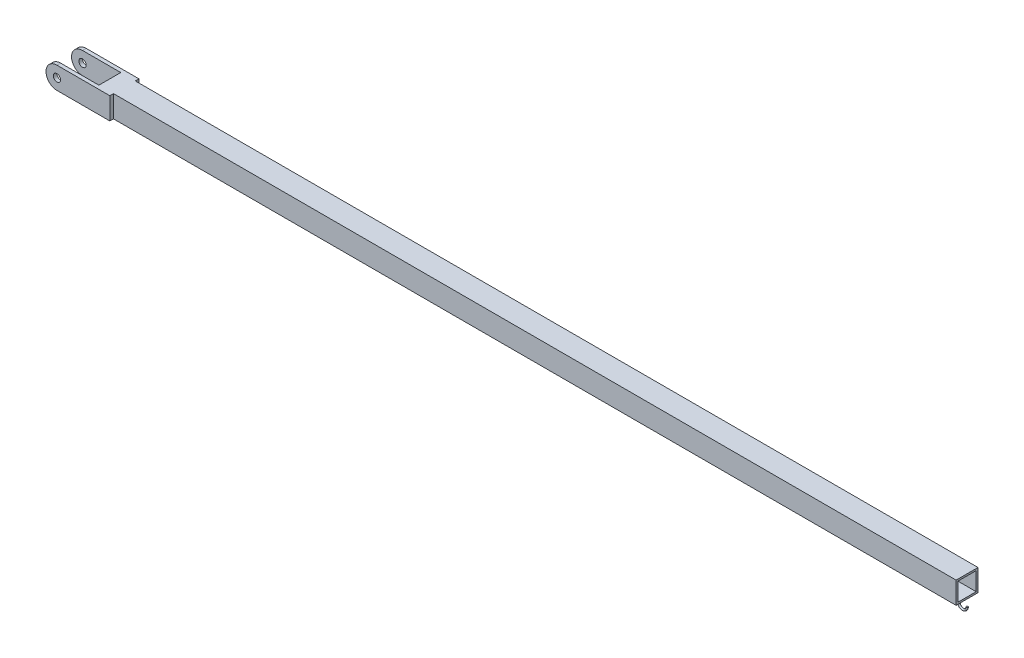
ISO-10303-21;
HEADER;
FILE_DESCRIPTION(('STEP AP214'),'2;1');
FILE_NAME('part.step','',(''),(''),'','','');
FILE_SCHEMA(('AUTOMOTIVE_DESIGN { 1 0 10303 214 1 1 1 1 }'));
ENDSEC;
DATA;
#1=APPLICATION_CONTEXT('core data for automotive mechanical design processes');
#2=APPLICATION_PROTOCOL_DEFINITION('international standard','automotive_design',2000,#1);
#3=PRODUCT_CONTEXT('',#1,'mechanical');
#4=PRODUCT('Part','Part','',(#3));
#5=PRODUCT_RELATED_PRODUCT_CATEGORY('part','',(#4));
#6=PRODUCT_DEFINITION_FORMATION('','',#4);
#7=PRODUCT_DEFINITION_CONTEXT('part definition',#1,'design');
#8=PRODUCT_DEFINITION('design','',#6,#7);
#9=PRODUCT_DEFINITION_SHAPE('','',#8);
#10=(LENGTH_UNIT() NAMED_UNIT(*) SI_UNIT(.MILLI.,.METRE.));
#11=(NAMED_UNIT(*) PLANE_ANGLE_UNIT() SI_UNIT($,.RADIAN.));
#12=(NAMED_UNIT(*) SI_UNIT($,.STERADIAN.) SOLID_ANGLE_UNIT());
#13=UNCERTAINTY_MEASURE_WITH_UNIT(LENGTH_MEASURE(1.E-05),#10,'distance_accuracy_value','');
#14=(GEOMETRIC_REPRESENTATION_CONTEXT(3) GLOBAL_UNCERTAINTY_ASSIGNED_CONTEXT((#13)) GLOBAL_UNIT_ASSIGNED_CONTEXT((#10,
#11,#12)) REPRESENTATION_CONTEXT('',''));
#15=CARTESIAN_POINT('',(0.,0.,0.));
#16=DIRECTION('',(0.,0.,1.));
#17=DIRECTION('',(1.,0.,0.));
#18=AXIS2_PLACEMENT_3D('',#15,#16,#17);
#19=CARTESIAN_POINT('',(-1492.25,-19.05,-19.05));
#20=DIRECTION('',(0.,0.,-1.));
#21=DIRECTION('',(-1.,0.,0.));
#22=AXIS2_PLACEMENT_3D('',#19,#20,#21);
#23=PLANE('',#22);
#24=DIRECTION('',(1.,0.,0.));
#25=VECTOR('',#24,1.);
#26=CARTESIAN_POINT('',(-1492.25,-19.05,-19.05));
#27=LINE('',#26,#25);
#28=CARTESIAN_POINT('',(-1466.85,-19.05,-19.05));
#29=VERTEX_POINT('',#28);
#30=CARTESIAN_POINT('',(0.,-19.05,-19.05));
#31=VERTEX_POINT('',#30);
#32=EDGE_CURVE('E290',#29,#31,#27,.T.);
#33=ORIENTED_EDGE('',*,*,#32,.F.);
#34=DIRECTION('',(0.,1.,0.));
#35=VECTOR('',#34,1.);
#36=CARTESIAN_POINT('',(-1466.85,19.05,-19.05));
#37=LINE('',#36,#35);
#38=CARTESIAN_POINT('',(-1466.85,19.05,-19.05));
#39=VERTEX_POINT('',#38);
#40=EDGE_CURVE('E187',#29,#39,#37,.T.);
#41=ORIENTED_EDGE('',*,*,#40,.T.);
#42=DIRECTION('',(1.,0.,0.));
#43=VECTOR('',#42,1.);
#44=CARTESIAN_POINT('',(-1492.25,19.05,-19.05));
#45=LINE('',#44,#43);
#46=CARTESIAN_POINT('',(0.,19.05,-19.05));
#47=VERTEX_POINT('',#46);
#48=EDGE_CURVE('E288',#39,#47,#45,.T.);
#49=ORIENTED_EDGE('',*,*,#48,.T.);
#50=DIRECTION('',(0.,1.,0.));
#51=VECTOR('',#50,1.);
#52=CARTESIAN_POINT('',(0.,-19.05,-19.05));
#53=LINE('',#52,#51);
#54=EDGE_CURVE('E282',#31,#47,#53,.T.);
#55=ORIENTED_EDGE('',*,*,#54,.F.);
#56=EDGE_LOOP('',(#33,#41,#49,#55));
#57=FACE_BOUND('',#56,.T.);
#58=ADVANCED_FACE('F36',(#57),#23,.T.);
#59=CARTESIAN_POINT('',(-1492.25,-19.05,19.05));
#60=DIRECTION('',(0.,0.,1.));
#61=DIRECTION('',(1.,0.,0.));
#62=AXIS2_PLACEMENT_3D('',#59,#60,#61);
#63=PLANE('',#62);
#64=DIRECTION('',(0.,1.,0.));
#65=VECTOR('',#64,1.);
#66=CARTESIAN_POINT('',(-1466.85,19.05,19.05));
#67=LINE('',#66,#65);
#68=CARTESIAN_POINT('',(-1466.85,-19.05,19.05));
#69=VERTEX_POINT('',#68);
#70=CARTESIAN_POINT('',(-1466.85,19.05,19.05));
#71=VERTEX_POINT('',#70);
#72=EDGE_CURVE('E61',#69,#71,#67,.T.);
#73=ORIENTED_EDGE('',*,*,#72,.F.);
#74=DIRECTION('',(1.,0.,0.));
#75=VECTOR('',#74,1.);
#76=CARTESIAN_POINT('',(-1492.25,-19.05,19.05));
#77=LINE('',#76,#75);
#78=CARTESIAN_POINT('',(0.,-19.05,19.05));
#79=VERTEX_POINT('',#78);
#80=EDGE_CURVE('E276',#69,#79,#77,.T.);
#81=ORIENTED_EDGE('',*,*,#80,.T.);
#82=DIRECTION('',(0.,-1.,0.));
#83=VECTOR('',#82,1.);
#84=CARTESIAN_POINT('',(0.,-19.05,19.05));
#85=LINE('',#84,#83);
#86=CARTESIAN_POINT('',(0.,19.05,19.05));
#87=VERTEX_POINT('',#86);
#88=EDGE_CURVE('E234',#87,#79,#85,.T.);
#89=ORIENTED_EDGE('',*,*,#88,.F.);
#90=DIRECTION('',(1.,0.,0.));
#91=VECTOR('',#90,1.);
#92=CARTESIAN_POINT('',(-1492.25,19.05,19.05));
#93=LINE('',#92,#91);
#94=EDGE_CURVE('E45',#71,#87,#93,.T.);
#95=ORIENTED_EDGE('',*,*,#94,.F.);
#96=EDGE_LOOP('',(#73,#81,#89,#95));
#97=FACE_BOUND('',#96,.T.);
#98=ADVANCED_FACE('F38',(#97),#63,.T.);
#99=CARTESIAN_POINT('',(-1492.25,19.05,-19.05));
#100=DIRECTION('',(0.,1.,0.));
#101=DIRECTION('',(0.,0.,1.));
#102=AXIS2_PLACEMENT_3D('',#99,#100,#101);
#103=PLANE('',#102);
#104=DIRECTION('',(0.,0.,1.));
#105=VECTOR('',#104,1.);
#106=CARTESIAN_POINT('',(0.,19.05,-19.05));
#107=LINE('',#106,#105);
#108=EDGE_CURVE('E268',#47,#87,#107,.T.);
#109=ORIENTED_EDGE('',*,*,#108,.F.);
#110=ORIENTED_EDGE('',*,*,#48,.F.);
#111=DIRECTION('',(0.,0.,1.));
#112=VECTOR('',#111,1.);
#113=CARTESIAN_POINT('',(-1466.85,19.05,-25.4));
#114=LINE('',#113,#112);
#115=CARTESIAN_POINT('',(-1466.85,19.05,-25.4));
#116=VERTEX_POINT('',#115);
#117=EDGE_CURVE('E53',#116,#39,#114,.T.);
#118=ORIENTED_EDGE('',*,*,#117,.F.);
#119=DIRECTION('',(-1.,0.,0.));
#120=VECTOR('',#119,1.);
#121=CARTESIAN_POINT('',(-1558.925,19.0499999999996,-25.4));
#122=LINE('',#121,#120);
#123=CARTESIAN_POINT('',(-1558.925,19.0499999999996,-25.4));
#124=VERTEX_POINT('',#123);
#125=EDGE_CURVE('E173',#116,#124,#122,.T.);
#126=ORIENTED_EDGE('',*,*,#125,.T.);
#127=DIRECTION('',(0.,0.,1.));
#128=VECTOR('',#127,1.);
#129=CARTESIAN_POINT('',(-1558.925,19.0499999999996,-25.4));
#130=LINE('',#129,#128);
#131=CARTESIAN_POINT('',(-1558.925,19.0499999999996,-19.05));
#132=VERTEX_POINT('',#131);
#133=EDGE_CURVE('E185',#124,#132,#130,.T.);
#134=ORIENTED_EDGE('',*,*,#133,.T.);
#135=DIRECTION('',(-1.,0.,0.));
#136=VECTOR('',#135,1.);
#137=CARTESIAN_POINT('',(-1492.25,19.05,-19.05));
#138=LINE('',#137,#136);
#139=CARTESIAN_POINT('',(-1492.25,19.05,-19.05));
#140=VERTEX_POINT('',#139);
#141=EDGE_CURVE('E172',#140,#132,#138,.T.);
#142=ORIENTED_EDGE('',*,*,#141,.F.);
#143=DIRECTION('',(0.,0.,1.));
#144=VECTOR('',#143,1.);
#145=CARTESIAN_POINT('',(-1492.25,19.05,-19.05));
#146=LINE('',#145,#144);
#147=CARTESIAN_POINT('',(-1492.25,19.05,19.05));
#148=VERTEX_POINT('',#147);
#149=EDGE_CURVE('E273',#140,#148,#146,.T.);
#150=ORIENTED_EDGE('',*,*,#149,.T.);
#151=DIRECTION('',(-1.,0.,0.));
#152=VECTOR('',#151,1.);
#153=CARTESIAN_POINT('',(-1492.25,19.05,19.05));
#154=LINE('',#153,#152);
#155=CARTESIAN_POINT('',(-1558.925,19.0499999999996,19.05));
#156=VERTEX_POINT('',#155);
#157=EDGE_CURVE('E205',#148,#156,#154,.T.);
#158=ORIENTED_EDGE('',*,*,#157,.T.);
#159=DIRECTION('',(0.,0.,-1.));
#160=VECTOR('',#159,1.);
#161=CARTESIAN_POINT('',(-1558.925,19.0499999999996,25.4));
#162=LINE('',#161,#160);
#163=CARTESIAN_POINT('',(-1558.925,19.0499999999996,25.4));
#164=VERTEX_POINT('',#163);
#165=EDGE_CURVE('E228',#164,#156,#162,.T.);
#166=ORIENTED_EDGE('',*,*,#165,.F.);
#167=DIRECTION('',(-1.,0.,0.));
#168=VECTOR('',#167,1.);
#169=CARTESIAN_POINT('',(-1558.925,19.0499999999996,25.4));
#170=LINE('',#169,#168);
#171=CARTESIAN_POINT('',(-1466.85,19.05,25.4));
#172=VERTEX_POINT('',#171);
#173=EDGE_CURVE('E201',#172,#164,#170,.T.);
#174=ORIENTED_EDGE('',*,*,#173,.F.);
#175=DIRECTION('',(0.,0.,-1.));
#176=VECTOR('',#175,1.);
#177=CARTESIAN_POINT('',(-1466.85,19.05,25.4));
#178=LINE('',#177,#176);
#179=EDGE_CURVE('E212',#172,#71,#178,.T.);
#180=ORIENTED_EDGE('',*,*,#179,.T.);
#181=ORIENTED_EDGE('',*,*,#94,.T.);
#182=EDGE_LOOP('',(#109,#110,#118,#126,#134,#142,#150,#158,#166,#174,#180,#181));
#183=FACE_BOUND('',#182,.T.);
#184=ADVANCED_FACE('F303',(#183),#103,.T.);
#185=CARTESIAN_POINT('',(-1492.25,-19.05,-19.05));
#186=DIRECTION('',(0.,-1.,0.));
#187=DIRECTION('',(0.,0.,-1.));
#188=AXIS2_PLACEMENT_3D('',#185,#186,#187);
#189=PLANE('',#188);
#190=CARTESIAN_POINT('',(-14.2875,-19.05,0.));
#191=DIRECTION('',(0.,-1.,0.));
#192=DIRECTION('',(0.,0.,-1.));
#193=AXIS2_PLACEMENT_3D('',#190,#191,#192);
#194=CIRCLE('',#193,1.5875);
#195=CARTESIAN_POINT('',(-14.2875,-19.05,-1.5875));
#196=VERTEX_POINT('',#195);
#197=EDGE_CURVE('E11',#196,#196,#194,.T.);
#198=ORIENTED_EDGE('',*,*,#197,.F.);
#199=EDGE_LOOP('',(#198));
#200=FACE_BOUND('',#199,.T.);
#201=DIRECTION('',(0.,0.,-1.));
#202=VECTOR('',#201,1.);
#203=CARTESIAN_POINT('',(0.,-19.05,-19.05));
#204=LINE('',#203,#202);
#205=EDGE_CURVE('E279',#79,#31,#204,.T.);
#206=ORIENTED_EDGE('',*,*,#205,.F.);
#207=ORIENTED_EDGE('',*,*,#80,.F.);
#208=DIRECTION('',(0.,0.,-1.));
#209=VECTOR('',#208,1.);
#210=CARTESIAN_POINT('',(-1466.85,-19.05,25.4));
#211=LINE('',#210,#209);
#212=CARTESIAN_POINT('',(-1466.85,-19.05,25.4));
#213=VERTEX_POINT('',#212);
#214=EDGE_CURVE('E222',#213,#69,#211,.T.);
#215=ORIENTED_EDGE('',*,*,#214,.F.);
#216=DIRECTION('',(1.,0.,0.));
#217=VECTOR('',#216,1.);
#218=CARTESIAN_POINT('',(-1492.25,-19.05,25.4));
#219=LINE('',#218,#217);
#220=CARTESIAN_POINT('',(-1558.925,-19.05,25.4));
#221=VERTEX_POINT('',#220);
#222=EDGE_CURVE('E207',#221,#213,#219,.T.);
#223=ORIENTED_EDGE('',*,*,#222,.F.);
#224=DIRECTION('',(0.,0.,-1.));
#225=VECTOR('',#224,1.);
#226=CARTESIAN_POINT('',(-1558.925,-19.05,25.4));
#227=LINE('',#226,#225);
#228=CARTESIAN_POINT('',(-1558.925,-19.05,19.05));
#229=VERTEX_POINT('',#228);
#230=EDGE_CURVE('E225',#221,#229,#227,.T.);
#231=ORIENTED_EDGE('',*,*,#230,.T.);
#232=DIRECTION('',(1.,0.,0.));
#233=VECTOR('',#232,1.);
#234=CARTESIAN_POINT('',(-1466.85,-19.05,19.05));
#235=LINE('',#234,#233);
#236=CARTESIAN_POINT('',(-1492.25,-19.05,19.05));
#237=VERTEX_POINT('',#236);
#238=EDGE_CURVE('E215',#229,#237,#235,.T.);
#239=ORIENTED_EDGE('',*,*,#238,.T.);
#240=DIRECTION('',(0.,0.,-1.));
#241=VECTOR('',#240,1.);
#242=CARTESIAN_POINT('',(-1492.25,-19.05,-19.05));
#243=LINE('',#242,#241);
#244=CARTESIAN_POINT('',(-1492.25,-19.05,-19.05));
#245=VERTEX_POINT('',#244);
#246=EDGE_CURVE('E267',#237,#245,#243,.T.);
#247=ORIENTED_EDGE('',*,*,#246,.T.);
#248=DIRECTION('',(1.,0.,0.));
#249=VECTOR('',#248,1.);
#250=CARTESIAN_POINT('',(-1492.25,-19.05,-19.05));
#251=LINE('',#250,#249);
#252=CARTESIAN_POINT('',(-1558.925,-19.05,-19.05));
#253=VERTEX_POINT('',#252);
#254=EDGE_CURVE('E189',#253,#245,#251,.T.);
#255=ORIENTED_EDGE('',*,*,#254,.F.);
#256=DIRECTION('',(0.,0.,1.));
#257=VECTOR('',#256,1.);
#258=CARTESIAN_POINT('',(-1558.925,-19.05,-25.4));
#259=LINE('',#258,#257);
#260=CARTESIAN_POINT('',(-1558.925,-19.05,-25.4));
#261=VERTEX_POINT('',#260);
#262=EDGE_CURVE('E195',#261,#253,#259,.T.);
#263=ORIENTED_EDGE('',*,*,#262,.F.);
#264=DIRECTION('',(1.,0.,0.));
#265=VECTOR('',#264,1.);
#266=CARTESIAN_POINT('',(-1466.85,-19.05,-25.4));
#267=LINE('',#266,#265);
#268=CARTESIAN_POINT('',(-1466.85,-19.05,-25.4));
#269=VERTEX_POINT('',#268);
#270=EDGE_CURVE('E179',#261,#269,#267,.T.);
#271=ORIENTED_EDGE('',*,*,#270,.T.);
#272=DIRECTION('',(0.,0.,1.));
#273=VECTOR('',#272,1.);
#274=CARTESIAN_POINT('',(-1466.85,-19.05,-25.4));
#275=LINE('',#274,#273);
#276=EDGE_CURVE('E197',#269,#29,#275,.T.);
#277=ORIENTED_EDGE('',*,*,#276,.T.);
#278=ORIENTED_EDGE('',*,*,#32,.T.);
#279=EDGE_LOOP('',(#206,#207,#215,#223,#231,#239,#247,#255,#263,#271,#277,#278));
#280=FACE_BOUND('',#279,.T.);
#281=ADVANCED_FACE('F295',(#200,#280),#189,.T.);
#282=CARTESIAN_POINT('',(-1492.25,0.,0.));
#283=DIRECTION('',(1.,0.,0.));
#284=DIRECTION('',(0.,0.,-1.));
#285=AXIS2_PLACEMENT_3D('',#282,#283,#284);
#286=PLANE('',#285);
#287=DIRECTION('',(0.,0.,1.));
#288=VECTOR('',#287,1.);
#289=CARTESIAN_POINT('',(-1492.25,15.875,0.));
#290=LINE('',#289,#288);
#291=CARTESIAN_POINT('',(-1492.25,15.875,-15.875));
#292=VERTEX_POINT('',#291);
#293=CARTESIAN_POINT('',(-1492.25,15.875,15.875));
#294=VERTEX_POINT('',#293);
#295=EDGE_CURVE('E239',#292,#294,#290,.T.);
#296=ORIENTED_EDGE('',*,*,#295,.T.);
#297=DIRECTION('',(0.,-1.,0.));
#298=VECTOR('',#297,1.);
#299=CARTESIAN_POINT('',(-1492.25,0.,15.875));
#300=LINE('',#299,#298);
#301=CARTESIAN_POINT('',(-1492.25,-15.875,15.875));
#302=VERTEX_POINT('',#301);
#303=EDGE_CURVE('E253',#294,#302,#300,.T.);
#304=ORIENTED_EDGE('',*,*,#303,.T.);
#305=DIRECTION('',(0.,0.,-1.));
#306=VECTOR('',#305,1.);
#307=CARTESIAN_POINT('',(-1492.25,-15.875,0.));
#308=LINE('',#307,#306);
#309=CARTESIAN_POINT('',(-1492.25,-15.875,-15.875));
#310=VERTEX_POINT('',#309);
#311=EDGE_CURVE('E256',#302,#310,#308,.T.);
#312=ORIENTED_EDGE('',*,*,#311,.T.);
#313=DIRECTION('',(0.,1.,0.));
#314=VECTOR('',#313,1.);
#315=CARTESIAN_POINT('',(-1492.25,0.,-15.875));
#316=LINE('',#315,#314);
#317=EDGE_CURVE('E259',#310,#292,#316,.T.);
#318=ORIENTED_EDGE('',*,*,#317,.T.);
#319=EDGE_LOOP('',(#296,#304,#312,#318));
#320=FACE_BOUND('',#319,.T.);
#321=DIRECTION('',(0.,-1.,0.));
#322=VECTOR('',#321,1.);
#323=CARTESIAN_POINT('',(-1492.25,-19.05,19.05));
#324=LINE('',#323,#322);
#325=EDGE_CURVE('E264',#148,#237,#324,.T.);
#326=ORIENTED_EDGE('',*,*,#325,.F.);
#327=ORIENTED_EDGE('',*,*,#149,.F.);
#328=DIRECTION('',(0.,1.,0.));
#329=VECTOR('',#328,1.);
#330=CARTESIAN_POINT('',(-1492.25,-19.05,-19.05));
#331=LINE('',#330,#329);
#332=EDGE_CURVE('E271',#245,#140,#331,.T.);
#333=ORIENTED_EDGE('',*,*,#332,.F.);
#334=ORIENTED_EDGE('',*,*,#246,.F.);
#335=EDGE_LOOP('',(#326,#327,#333,#334));
#336=FACE_BOUND('',#335,.T.);
#337=ADVANCED_FACE('F323',(#320,#336),#286,.F.);
#338=CARTESIAN_POINT('',(0.,0.,0.));
#339=DIRECTION('',(1.,0.,0.));
#340=DIRECTION('',(0.,0.,-1.));
#341=AXIS2_PLACEMENT_3D('',#338,#339,#340);
#342=PLANE('',#341);
#343=DIRECTION('',(0.,-1.,0.));
#344=VECTOR('',#343,1.);
#345=CARTESIAN_POINT('',(0.,0.,15.875));
#346=LINE('',#345,#344);
#347=CARTESIAN_POINT('',(0.,15.875,15.875));
#348=VERTEX_POINT('',#347);
#349=CARTESIAN_POINT('',(0.,-15.875,15.875));
#350=VERTEX_POINT('',#349);
#351=EDGE_CURVE('E231',#348,#350,#346,.T.);
#352=ORIENTED_EDGE('',*,*,#351,.F.);
#353=DIRECTION('',(0.,0.,1.));
#354=VECTOR('',#353,1.);
#355=CARTESIAN_POINT('',(0.,15.875,0.));
#356=LINE('',#355,#354);
#357=CARTESIAN_POINT('',(0.,15.875,-15.875));
#358=VERTEX_POINT('',#357);
#359=EDGE_CURVE('E250',#358,#348,#356,.T.);
#360=ORIENTED_EDGE('',*,*,#359,.F.);
#361=DIRECTION('',(0.,1.,0.));
#362=VECTOR('',#361,1.);
#363=CARTESIAN_POINT('',(0.,0.,-15.875));
#364=LINE('',#363,#362);
#365=CARTESIAN_POINT('',(0.,-15.875,-15.875));
#366=VERTEX_POINT('',#365);
#367=EDGE_CURVE('E248',#366,#358,#364,.T.);
#368=ORIENTED_EDGE('',*,*,#367,.F.);
#369=DIRECTION('',(0.,0.,-1.));
#370=VECTOR('',#369,1.);
#371=CARTESIAN_POINT('',(0.,-15.875,0.));
#372=LINE('',#371,#370);
#373=EDGE_CURVE('E245',#350,#366,#372,.T.);
#374=ORIENTED_EDGE('',*,*,#373,.F.);
#375=EDGE_LOOP('',(#352,#360,#368,#374));
#376=FACE_BOUND('',#375,.T.);
#377=ORIENTED_EDGE('',*,*,#88,.T.);
#378=ORIENTED_EDGE('',*,*,#205,.T.);
#379=ORIENTED_EDGE('',*,*,#54,.T.);
#380=ORIENTED_EDGE('',*,*,#108,.T.);
#381=EDGE_LOOP('',(#377,#378,#379,#380));
#382=FACE_BOUND('',#381,.T.);
#383=ADVANCED_FACE('F299',(#376,#382),#342,.T.);
#384=CARTESIAN_POINT('',(-1492.25,-19.05,15.875));
#385=DIRECTION('',(0.,0.,1.));
#386=DIRECTION('',(1.,0.,0.));
#387=AXIS2_PLACEMENT_3D('',#384,#385,#386);
#388=PLANE('',#387);
#389=ORIENTED_EDGE('',*,*,#351,.T.);
#390=DIRECTION('',(1.,0.,0.));
#391=VECTOR('',#390,1.);
#392=CARTESIAN_POINT('',(-1492.25,-15.875,15.875));
#393=LINE('',#392,#391);
#394=EDGE_CURVE('E236',#302,#350,#393,.T.);
#395=ORIENTED_EDGE('',*,*,#394,.F.);
#396=ORIENTED_EDGE('',*,*,#303,.F.);
#397=DIRECTION('',(1.,0.,0.));
#398=VECTOR('',#397,1.);
#399=CARTESIAN_POINT('',(-1492.25,15.875,15.875));
#400=LINE('',#399,#398);
#401=EDGE_CURVE('E232',#294,#348,#400,.T.);
#402=ORIENTED_EDGE('',*,*,#401,.T.);
#403=EDGE_LOOP('',(#389,#395,#396,#402));
#404=FACE_BOUND('',#403,.T.);
#405=ADVANCED_FACE('F393',(#404),#388,.F.);
#406=CARTESIAN_POINT('',(-1492.25,15.875,-19.05));
#407=DIRECTION('',(0.,1.,0.));
#408=DIRECTION('',(0.,0.,1.));
#409=AXIS2_PLACEMENT_3D('',#406,#407,#408);
#410=PLANE('',#409);
#411=ORIENTED_EDGE('',*,*,#359,.T.);
#412=ORIENTED_EDGE('',*,*,#401,.F.);
#413=ORIENTED_EDGE('',*,*,#295,.F.);
#414=DIRECTION('',(1.,0.,0.));
#415=VECTOR('',#414,1.);
#416=CARTESIAN_POINT('',(-1492.25,15.875,-15.875));
#417=LINE('',#416,#415);
#418=EDGE_CURVE('E235',#292,#358,#417,.T.);
#419=ORIENTED_EDGE('',*,*,#418,.T.);
#420=EDGE_LOOP('',(#411,#412,#413,#419));
#421=FACE_BOUND('',#420,.T.);
#422=ADVANCED_FACE('F396',(#421),#410,.F.);
#423=CARTESIAN_POINT('',(-1492.25,-19.05,-15.875));
#424=DIRECTION('',(0.,0.,-1.));
#425=DIRECTION('',(-1.,0.,0.));
#426=AXIS2_PLACEMENT_3D('',#423,#424,#425);
#427=PLANE('',#426);
#428=ORIENTED_EDGE('',*,*,#367,.T.);
#429=ORIENTED_EDGE('',*,*,#418,.F.);
#430=ORIENTED_EDGE('',*,*,#317,.F.);
#431=DIRECTION('',(1.,0.,0.));
#432=VECTOR('',#431,1.);
#433=CARTESIAN_POINT('',(-1492.25,-15.875,-15.875));
#434=LINE('',#433,#432);
#435=EDGE_CURVE('E238',#310,#366,#434,.T.);
#436=ORIENTED_EDGE('',*,*,#435,.T.);
#437=EDGE_LOOP('',(#428,#429,#430,#436));
#438=FACE_BOUND('',#437,.T.);
#439=ADVANCED_FACE('F400',(#438),#427,.F.);
#440=CARTESIAN_POINT('',(-1492.25,-15.875,-19.05));
#441=DIRECTION('',(0.,-1.,0.));
#442=DIRECTION('',(0.,0.,-1.));
#443=AXIS2_PLACEMENT_3D('',#440,#441,#442);
#444=PLANE('',#443);
#445=ORIENTED_EDGE('',*,*,#373,.T.);
#446=ORIENTED_EDGE('',*,*,#435,.F.);
#447=ORIENTED_EDGE('',*,*,#311,.F.);
#448=ORIENTED_EDGE('',*,*,#394,.T.);
#449=EDGE_LOOP('',(#445,#446,#447,#448));
#450=FACE_BOUND('',#449,.T.);
#451=ADVANCED_FACE('F392',(#450),#444,.F.);
#452=CARTESIAN_POINT('',(-1558.925,-1.90913251136079E-13,25.4));
#453=DIRECTION('',(0.,0.,-1.));
#454=DIRECTION('',(-1.,0.,0.));
#455=AXIS2_PLACEMENT_3D('',#452,#453,#454);
#456=CYLINDRICAL_SURFACE('',#455,19.0499999999998);
#457=CARTESIAN_POINT('',(-1558.925,-1.90913251136079E-13,19.05));
#458=DIRECTION('',(0.,0.,1.));
#459=DIRECTION('',(-1.,0.,0.));
#460=AXIS2_PLACEMENT_3D('',#457,#458,#459);
#461=CIRCLE('',#460,19.0499999999998);
#462=EDGE_CURVE('E200',#156,#229,#461,.T.);
#463=ORIENTED_EDGE('',*,*,#462,.T.);
#464=ORIENTED_EDGE('',*,*,#230,.F.);
#465=CARTESIAN_POINT('',(-1558.925,-1.90913251136079E-13,25.4));
#466=DIRECTION('',(0.,0.,1.));
#467=DIRECTION('',(-1.,0.,0.));
#468=AXIS2_PLACEMENT_3D('',#465,#466,#467);
#469=CIRCLE('',#468,19.0499999999998);
#470=EDGE_CURVE('E204',#164,#221,#469,.T.);
#471=ORIENTED_EDGE('',*,*,#470,.F.);
#472=ORIENTED_EDGE('',*,*,#165,.T.);
#473=EDGE_LOOP('',(#463,#464,#471,#472));
#474=FACE_BOUND('',#473,.T.);
#475=ADVANCED_FACE('F314',(#474),#456,.T.);
#476=CARTESIAN_POINT('',(-1466.85,19.05,25.4));
#477=DIRECTION('',(-1.,0.,0.));
#478=DIRECTION('',(0.,0.,1.));
#479=AXIS2_PLACEMENT_3D('',#476,#477,#478);
#480=PLANE('',#479);
#481=ORIENTED_EDGE('',*,*,#72,.T.);
#482=ORIENTED_EDGE('',*,*,#179,.F.);
#483=DIRECTION('',(0.,1.,0.));
#484=VECTOR('',#483,1.);
#485=CARTESIAN_POINT('',(-1466.85,19.05,25.4));
#486=LINE('',#485,#484);
#487=EDGE_CURVE('E209',#213,#172,#486,.T.);
#488=ORIENTED_EDGE('',*,*,#487,.F.);
#489=ORIENTED_EDGE('',*,*,#214,.T.);
#490=EDGE_LOOP('',(#481,#482,#488,#489));
#491=FACE_BOUND('',#490,.T.);
#492=ADVANCED_FACE('F306',(#491),#480,.F.);
#493=CARTESIAN_POINT('',(-1558.925,-1.90913251136079E-13,25.4));
#494=DIRECTION('',(0.,0.,-1.));
#495=DIRECTION('',(-1.,0.,0.));
#496=AXIS2_PLACEMENT_3D('',#493,#494,#495);
#497=PLANE('',#496);
#498=CARTESIAN_POINT('',(-1558.925,-1.90913251136079E-13,25.4));
#499=DIRECTION('',(0.,0.,1.));
#500=DIRECTION('',(1.,0.,0.));
#501=AXIS2_PLACEMENT_3D('',#498,#499,#500);
#502=CIRCLE('',#501,6.35000000000016);
#503=CARTESIAN_POINT('',(-1552.575,-1.90913251136079E-13,25.4));
#504=VERTEX_POINT('',#503);
#505=EDGE_CURVE('E158',#504,#504,#502,.T.);
#506=ORIENTED_EDGE('',*,*,#505,.F.);
#507=EDGE_LOOP('',(#506));
#508=FACE_BOUND('',#507,.T.);
#509=ORIENTED_EDGE('',*,*,#173,.T.);
#510=ORIENTED_EDGE('',*,*,#470,.T.);
#511=ORIENTED_EDGE('',*,*,#222,.T.);
#512=ORIENTED_EDGE('',*,*,#487,.T.);
#513=EDGE_LOOP('',(#509,#510,#511,#512));
#514=FACE_BOUND('',#513,.T.);
#515=ADVANCED_FACE('F311',(#508,#514),#497,.F.);
#516=CARTESIAN_POINT('',(-1558.925,-1.90913251136079E-13,19.05));
#517=DIRECTION('',(0.,0.,-1.));
#518=DIRECTION('',(-1.,0.,0.));
#519=AXIS2_PLACEMENT_3D('',#516,#517,#518);
#520=PLANE('',#519);
#521=CARTESIAN_POINT('',(-1558.925,-1.90913251136079E-13,19.05));
#522=DIRECTION('',(0.,0.,-1.));
#523=DIRECTION('',(-1.,0.,0.));
#524=AXIS2_PLACEMENT_3D('',#521,#522,#523);
#525=CIRCLE('',#524,6.35000000000016);
#526=CARTESIAN_POINT('',(-1565.275,-1.90913251136079E-13,19.05));
#527=VERTEX_POINT('',#526);
#528=EDGE_CURVE('E169',#527,#527,#525,.T.);
#529=ORIENTED_EDGE('',*,*,#528,.F.);
#530=EDGE_LOOP('',(#529));
#531=FACE_BOUND('',#530,.T.);
#532=ORIENTED_EDGE('',*,*,#157,.F.);
#533=ORIENTED_EDGE('',*,*,#325,.T.);
#534=ORIENTED_EDGE('',*,*,#238,.F.);
#535=ORIENTED_EDGE('',*,*,#462,.F.);
#536=EDGE_LOOP('',(#532,#533,#534,#535));
#537=FACE_BOUND('',#536,.T.);
#538=ADVANCED_FACE('F318',(#531,#537),#520,.T.);
#539=CARTESIAN_POINT('',(-1466.85,19.05,-25.4));
#540=DIRECTION('',(1.,0.,0.));
#541=DIRECTION('',(0.,0.,-1.));
#542=AXIS2_PLACEMENT_3D('',#539,#540,#541);
#543=PLANE('',#542);
#544=ORIENTED_EDGE('',*,*,#40,.F.);
#545=ORIENTED_EDGE('',*,*,#276,.F.);
#546=DIRECTION('',(0.,1.,0.));
#547=VECTOR('',#546,1.);
#548=CARTESIAN_POINT('',(-1466.85,19.05,-25.4));
#549=LINE('',#548,#547);
#550=EDGE_CURVE('E176',#269,#116,#549,.T.);
#551=ORIENTED_EDGE('',*,*,#550,.T.);
#552=ORIENTED_EDGE('',*,*,#117,.T.);
#553=EDGE_LOOP('',(#544,#545,#551,#552));
#554=FACE_BOUND('',#553,.T.);
#555=ADVANCED_FACE('F335',(#554),#543,.T.);
#556=CARTESIAN_POINT('',(-1558.925,-1.90913251136079E-13,-25.4));
#557=DIRECTION('',(0.,0.,1.));
#558=DIRECTION('',(1.,0.,0.));
#559=AXIS2_PLACEMENT_3D('',#556,#557,#558);
#560=CYLINDRICAL_SURFACE('',#559,19.0499999999998);
#561=CARTESIAN_POINT('',(-1558.925,-1.90913251136079E-13,-19.05));
#562=DIRECTION('',(0.,0.,1.));
#563=DIRECTION('',(-1.,0.,0.));
#564=AXIS2_PLACEMENT_3D('',#561,#562,#563);
#565=CIRCLE('',#564,19.0499999999998);
#566=EDGE_CURVE('E177',#132,#253,#565,.T.);
#567=ORIENTED_EDGE('',*,*,#566,.F.);
#568=ORIENTED_EDGE('',*,*,#133,.F.);
#569=CARTESIAN_POINT('',(-1558.925,-1.90913251136079E-13,-25.4));
#570=DIRECTION('',(0.,0.,1.));
#571=DIRECTION('',(-1.,0.,0.));
#572=AXIS2_PLACEMENT_3D('',#569,#570,#571);
#573=CIRCLE('',#572,19.0499999999998);
#574=EDGE_CURVE('E182',#124,#261,#573,.T.);
#575=ORIENTED_EDGE('',*,*,#574,.T.);
#576=ORIENTED_EDGE('',*,*,#262,.T.);
#577=EDGE_LOOP('',(#567,#568,#575,#576));
#578=FACE_BOUND('',#577,.T.);
#579=ADVANCED_FACE('F331',(#578),#560,.T.);
#580=CARTESIAN_POINT('',(-1558.925,-1.90913251136079E-13,-25.4));
#581=DIRECTION('',(0.,0.,1.));
#582=DIRECTION('',(-1.,0.,0.));
#583=AXIS2_PLACEMENT_3D('',#580,#581,#582);
#584=PLANE('',#583);
#585=CARTESIAN_POINT('',(-1558.925,-1.90913251136079E-13,-25.4));
#586=DIRECTION('',(0.,0.,1.));
#587=DIRECTION('',(1.,0.,0.));
#588=AXIS2_PLACEMENT_3D('',#585,#586,#587);
#589=CIRCLE('',#588,6.35000000000016);
#590=CARTESIAN_POINT('',(-1552.575,-1.90913251136079E-13,-25.4));
#591=VERTEX_POINT('',#590);
#592=EDGE_CURVE('E162',#591,#591,#589,.T.);
#593=ORIENTED_EDGE('',*,*,#592,.T.);
#594=EDGE_LOOP('',(#593));
#595=FACE_BOUND('',#594,.T.);
#596=ORIENTED_EDGE('',*,*,#125,.F.);
#597=ORIENTED_EDGE('',*,*,#550,.F.);
#598=ORIENTED_EDGE('',*,*,#270,.F.);
#599=ORIENTED_EDGE('',*,*,#574,.F.);
#600=EDGE_LOOP('',(#596,#597,#598,#599));
#601=FACE_BOUND('',#600,.T.);
#602=ADVANCED_FACE('F334',(#595,#601),#584,.F.);
#603=CARTESIAN_POINT('',(-1558.925,-1.90913251136079E-13,-19.05));
#604=DIRECTION('',(0.,0.,1.));
#605=DIRECTION('',(-1.,0.,0.));
#606=AXIS2_PLACEMENT_3D('',#603,#604,#605);
#607=PLANE('',#606);
#608=CARTESIAN_POINT('',(-1558.925,-1.90913251136079E-13,-19.05));
#609=DIRECTION('',(0.,0.,1.));
#610=DIRECTION('',(1.,0.,0.));
#611=AXIS2_PLACEMENT_3D('',#608,#609,#610);
#612=CIRCLE('',#611,6.35000000000016);
#613=CARTESIAN_POINT('',(-1552.575,-1.90913251136079E-13,-19.05));
#614=VERTEX_POINT('',#613);
#615=EDGE_CURVE('E40',#614,#614,#612,.T.);
#616=ORIENTED_EDGE('',*,*,#615,.F.);
#617=EDGE_LOOP('',(#616));
#618=FACE_BOUND('',#617,.T.);
#619=ORIENTED_EDGE('',*,*,#254,.T.);
#620=ORIENTED_EDGE('',*,*,#332,.T.);
#621=ORIENTED_EDGE('',*,*,#141,.T.);
#622=ORIENTED_EDGE('',*,*,#566,.T.);
#623=EDGE_LOOP('',(#619,#620,#621,#622));
#624=FACE_BOUND('',#623,.T.);
#625=ADVANCED_FACE('F327',(#618,#624),#607,.T.);
#626=CARTESIAN_POINT('',(-1558.925,-1.90913251136079E-13,-25.4));
#627=DIRECTION('',(0.,0.,1.));
#628=DIRECTION('',(1.,0.,0.));
#629=AXIS2_PLACEMENT_3D('',#626,#627,#628);
#630=CYLINDRICAL_SURFACE('',#629,6.35000000000016);
#631=ORIENTED_EDGE('',*,*,#615,.T.);
#632=EDGE_LOOP('',(#631));
#633=FACE_BOUND('',#632,.T.);
#634=ORIENTED_EDGE('',*,*,#592,.F.);
#635=EDGE_LOOP('',(#634));
#636=FACE_BOUND('',#635,.T.);
#637=ADVANCED_FACE('F368',(#633,#636),#630,.F.);
#638=ORIENTED_EDGE('',*,*,#528,.T.);
#639=EDGE_LOOP('',(#638));
#640=FACE_BOUND('',#639,.T.);
#641=ORIENTED_EDGE('',*,*,#505,.T.);
#642=EDGE_LOOP('',(#641));
#643=FACE_BOUND('',#642,.T.);
#644=ADVANCED_FACE('F364',(#640,#643),#630,.F.);
#645=CARTESIAN_POINT('',(0.,-30.95625,0.));
#646=DIRECTION('',(0.,1.,0.));
#647=DIRECTION('',(0.,0.,-1.));
#648=AXIS2_PLACEMENT_3D('',#645,#646,#647);
#649=PLANE('',#648);
#650=CARTESIAN_POINT('',(0.,-30.95625,0.));
#651=DIRECTION('',(0.,1.,0.));
#652=DIRECTION('',(0.,0.,-1.));
#653=AXIS2_PLACEMENT_3D('',#650,#651,#652);
#654=CIRCLE('',#653,1.5875);
#655=CARTESIAN_POINT('',(0.,-30.95625,-1.5875));
#656=VERTEX_POINT('',#655);
#657=EDGE_CURVE('E155',#656,#656,#654,.T.);
#658=ORIENTED_EDGE('',*,*,#657,.T.);
#659=EDGE_LOOP('',(#658));
#660=FACE_BOUND('',#659,.T.);
#661=ADVANCED_FACE('F156',(#660),#649,.T.);
#662=CARTESIAN_POINT('',(-14.2875,-19.05,0.));
#663=DIRECTION('',(0.,-1.,0.));
#664=DIRECTION('',(1.,0.,0.));
#665=AXIS2_PLACEMENT_3D('',#662,#663,#664);
#666=CYLINDRICAL_SURFACE('',#665,1.5875);
#667=CARTESIAN_POINT('',(-14.2875,-30.95625,0.));
#668=DIRECTION('',(0.,-1.,0.));
#669=DIRECTION('',(0.,0.,-1.));
#670=AXIS2_PLACEMENT_3D('',#667,#668,#669);
#671=CIRCLE('',#670,1.5875);
#672=CARTESIAN_POINT('',(-14.2875,-30.95625,-1.5875));
#673=VERTEX_POINT('',#672);
#674=EDGE_CURVE('E159',#673,#673,#671,.T.);
#675=ORIENTED_EDGE('',*,*,#674,.F.);
#676=EDGE_LOOP('',(#675));
#677=FACE_BOUND('',#676,.T.);
#678=ORIENTED_EDGE('',*,*,#197,.T.);
#679=EDGE_LOOP('',(#678));
#680=FACE_BOUND('',#679,.T.);
#681=ADVANCED_FACE('F354',(#677,#680),#666,.T.);
#682=CARTESIAN_POINT('',(-7.14375,-30.95625,0.));
#683=DIRECTION('',(0.,0.,1.));
#684=DIRECTION('',(1.,0.,0.));
#685=AXIS2_PLACEMENT_3D('',#682,#683,#684);
#686=TOROIDAL_SURFACE('',#685,7.14375,1.5875);
#687=ORIENTED_EDGE('',*,*,#657,.F.);
#688=EDGE_LOOP('',(#687));
#689=FACE_BOUND('',#688,.T.);
#690=ORIENTED_EDGE('',*,*,#674,.T.);
#691=EDGE_LOOP('',(#690));
#692=FACE_BOUND('',#691,.T.);
#693=ADVANCED_FACE('F356',(#689,#692),#686,.T.);
#694=CLOSED_SHELL('',(#58,#98,#184,#281,#337,#383,#405,#422,#439,#451,#475,#492,#515,#538,#555,
#579,#602,#625,#637,#644,#661,#681,#693));
#695=MANIFOLD_SOLID_BREP('B2',#694);
#696=ADVANCED_BREP_SHAPE_REPRESENTATION('',(#18,#695),#14);
#697=SHAPE_DEFINITION_REPRESENTATION(#9,#696);
ENDSEC;
END-ISO-10303-21;
